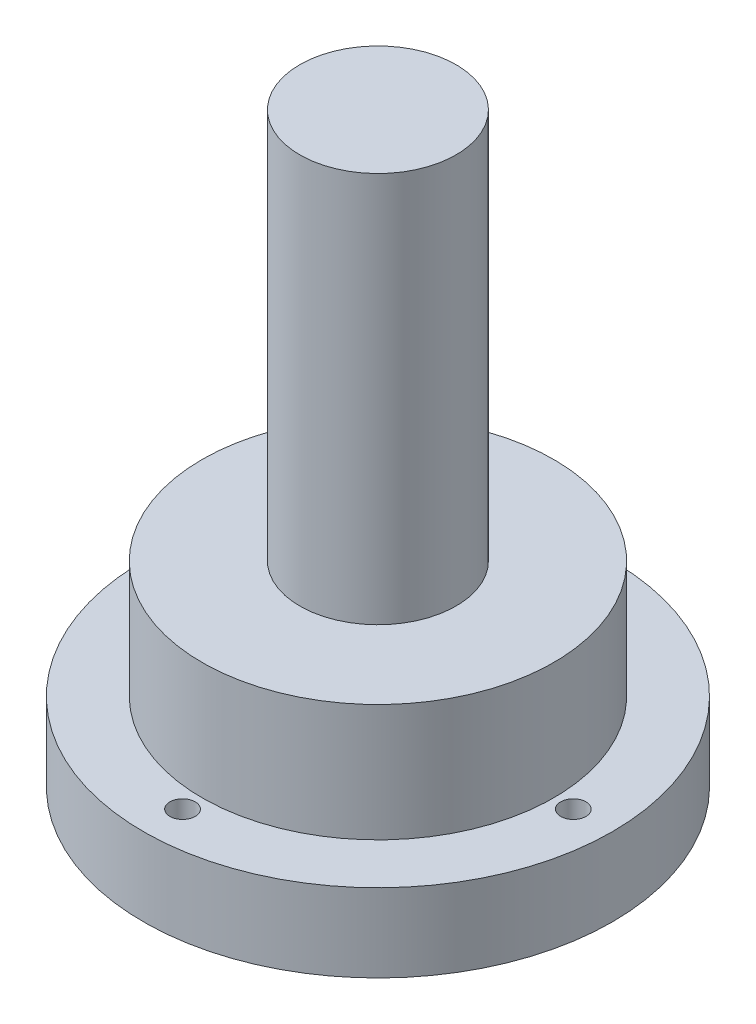
ISO-10303-21;
HEADER;
FILE_DESCRIPTION(('STEP AP214'),'2;1');
FILE_NAME('part.step','',(''),(''),'','','');
FILE_SCHEMA(('AUTOMOTIVE_DESIGN { 1 0 10303 214 1 1 1 1 }'));
ENDSEC;
DATA;
#1=APPLICATION_CONTEXT('core data for automotive mechanical design processes');
#2=APPLICATION_PROTOCOL_DEFINITION('international standard','automotive_design',2000,#1);
#3=PRODUCT_CONTEXT('',#1,'mechanical');
#4=PRODUCT('Part','Part','',(#3));
#5=PRODUCT_RELATED_PRODUCT_CATEGORY('part','',(#4));
#6=PRODUCT_DEFINITION_FORMATION('','',#4);
#7=PRODUCT_DEFINITION_CONTEXT('part definition',#1,'design');
#8=PRODUCT_DEFINITION('design','',#6,#7);
#9=PRODUCT_DEFINITION_SHAPE('','',#8);
#10=(LENGTH_UNIT() NAMED_UNIT(*) SI_UNIT(.MILLI.,.METRE.));
#11=(NAMED_UNIT(*) PLANE_ANGLE_UNIT() SI_UNIT($,.RADIAN.));
#12=(NAMED_UNIT(*) SI_UNIT($,.STERADIAN.) SOLID_ANGLE_UNIT());
#13=UNCERTAINTY_MEASURE_WITH_UNIT(LENGTH_MEASURE(1.E-05),#10,'distance_accuracy_value','');
#14=(GEOMETRIC_REPRESENTATION_CONTEXT(3) GLOBAL_UNCERTAINTY_ASSIGNED_CONTEXT((#13)) GLOBAL_UNIT_ASSIGNED_CONTEXT((#10,
#11,#12)) REPRESENTATION_CONTEXT('',''));
#15=CARTESIAN_POINT('',(0.,0.,0.));
#16=DIRECTION('',(0.,0.,1.));
#17=DIRECTION('',(1.,0.,0.));
#18=AXIS2_PLACEMENT_3D('',#15,#16,#17);
#19=CARTESIAN_POINT('',(0.,0.,0.));
#20=DIRECTION('',(0.,1.,0.));
#21=DIRECTION('',(1.,0.,0.));
#22=AXIS2_PLACEMENT_3D('',#19,#20,#21);
#23=PLANE('',#22);
#24=CARTESIAN_POINT('',(-25.,0.,0.));
#25=DIRECTION('',(0.,1.,0.));
#26=DIRECTION('',(1.,0.,0.));
#27=AXIS2_PLACEMENT_3D('',#24,#25,#26);
#28=CIRCLE('',#27,1.621);
#29=CARTESIAN_POINT('',(-26.621,0.,0.));
#30=VERTEX_POINT('',#29);
#31=EDGE_CURVE('E20',#30,#30,#28,.T.);
#32=ORIENTED_EDGE('',*,*,#31,.T.);
#33=EDGE_LOOP('',(#32));
#34=FACE_BOUND('',#33,.T.);
#35=CARTESIAN_POINT('',(25.,0.,0.));
#36=DIRECTION('',(0.,1.,0.));
#37=DIRECTION('',(1.,0.,0.));
#38=AXIS2_PLACEMENT_3D('',#35,#36,#37);
#39=CIRCLE('',#38,1.621);
#40=CARTESIAN_POINT('',(23.379,0.,0.));
#41=VERTEX_POINT('',#40);
#42=EDGE_CURVE('E119',#41,#41,#39,.T.);
#43=ORIENTED_EDGE('',*,*,#42,.T.);
#44=EDGE_LOOP('',(#43));
#45=FACE_BOUND('',#44,.T.);
#46=CARTESIAN_POINT('',(0.,0.,25.));
#47=DIRECTION('',(0.,1.,0.));
#48=DIRECTION('',(1.,0.,0.));
#49=AXIS2_PLACEMENT_3D('',#46,#47,#48);
#50=CIRCLE('',#49,1.621);
#51=CARTESIAN_POINT('',(-1.621,0.,25.));
#52=VERTEX_POINT('',#51);
#53=EDGE_CURVE('E143',#52,#52,#50,.T.);
#54=ORIENTED_EDGE('',*,*,#53,.T.);
#55=EDGE_LOOP('',(#54));
#56=FACE_BOUND('',#55,.T.);
#57=CARTESIAN_POINT('',(0.,0.,-25.));
#58=DIRECTION('',(0.,1.,0.));
#59=DIRECTION('',(1.,0.,0.));
#60=AXIS2_PLACEMENT_3D('',#57,#58,#59);
#61=CIRCLE('',#60,1.621);
#62=CARTESIAN_POINT('',(-1.621,0.,-25.));
#63=VERTEX_POINT('',#62);
#64=EDGE_CURVE('E163',#63,#63,#61,.T.);
#65=ORIENTED_EDGE('',*,*,#64,.T.);
#66=EDGE_LOOP('',(#65));
#67=FACE_BOUND('',#66,.T.);
#68=CARTESIAN_POINT('',(0.,0.,0.));
#69=DIRECTION('',(0.,1.,0.));
#70=DIRECTION('',(-1.,0.,0.));
#71=AXIS2_PLACEMENT_3D('',#68,#69,#70);
#72=CIRCLE('',#71,30.);
#73=CARTESIAN_POINT('',(30.,0.,0.));
#74=VERTEX_POINT('',#73);
#75=EDGE_CURVE('E11',#74,#74,#72,.T.);
#76=ORIENTED_EDGE('',*,*,#75,.F.);
#77=EDGE_LOOP('',(#76));
#78=FACE_BOUND('',#77,.T.);
#79=ADVANCED_FACE('F17',(#34,#45,#56,#67,#78),#23,.F.);
#80=CARTESIAN_POINT('',(0.,10.,0.));
#81=DIRECTION('',(0.,1.,0.));
#82=DIRECTION('',(1.,0.,0.));
#83=AXIS2_PLACEMENT_3D('',#80,#81,#82);
#84=PLANE('',#83);
#85=CARTESIAN_POINT('',(0.,10.,0.));
#86=DIRECTION('',(0.,-1.,0.));
#87=DIRECTION('',(1.,0.,0.));
#88=AXIS2_PLACEMENT_3D('',#85,#86,#87);
#89=CIRCLE('',#88,22.5);
#90=CARTESIAN_POINT('',(-22.5,10.,0.));
#91=VERTEX_POINT('',#90);
#92=EDGE_CURVE('E137',#91,#91,#89,.T.);
#93=ORIENTED_EDGE('',*,*,#92,.T.);
#94=EDGE_LOOP('',(#93));
#95=FACE_BOUND('',#94,.T.);
#96=CARTESIAN_POINT('',(-25.,10.,0.));
#97=DIRECTION('',(0.,-1.,0.));
#98=DIRECTION('',(1.,0.,0.));
#99=AXIS2_PLACEMENT_3D('',#96,#97,#98);
#100=CIRCLE('',#99,1.621);
#101=CARTESIAN_POINT('',(-26.621,10.,0.));
#102=VERTEX_POINT('',#101);
#103=EDGE_CURVE('E112',#102,#102,#100,.T.);
#104=ORIENTED_EDGE('',*,*,#103,.T.);
#105=EDGE_LOOP('',(#104));
#106=FACE_BOUND('',#105,.T.);
#107=CARTESIAN_POINT('',(25.,10.,0.));
#108=DIRECTION('',(0.,-1.,0.));
#109=DIRECTION('',(1.,0.,0.));
#110=AXIS2_PLACEMENT_3D('',#107,#108,#109);
#111=CIRCLE('',#110,1.621);
#112=CARTESIAN_POINT('',(23.379,10.,0.));
#113=VERTEX_POINT('',#112);
#114=EDGE_CURVE('E139',#113,#113,#111,.T.);
#115=ORIENTED_EDGE('',*,*,#114,.T.);
#116=EDGE_LOOP('',(#115));
#117=FACE_BOUND('',#116,.T.);
#118=CARTESIAN_POINT('',(0.,10.,25.));
#119=DIRECTION('',(0.,-1.,0.));
#120=DIRECTION('',(1.,0.,0.));
#121=AXIS2_PLACEMENT_3D('',#118,#119,#120);
#122=CIRCLE('',#121,1.621);
#123=CARTESIAN_POINT('',(-1.621,10.,25.));
#124=VERTEX_POINT('',#123);
#125=EDGE_CURVE('E159',#124,#124,#122,.T.);
#126=ORIENTED_EDGE('',*,*,#125,.T.);
#127=EDGE_LOOP('',(#126));
#128=FACE_BOUND('',#127,.T.);
#129=CARTESIAN_POINT('',(0.,10.,-25.));
#130=DIRECTION('',(0.,-1.,0.));
#131=DIRECTION('',(1.,0.,0.));
#132=AXIS2_PLACEMENT_3D('',#129,#130,#131);
#133=CIRCLE('',#132,1.621);
#134=CARTESIAN_POINT('',(-1.621,10.,-25.));
#135=VERTEX_POINT('',#134);
#136=EDGE_CURVE('E156',#135,#135,#133,.T.);
#137=ORIENTED_EDGE('',*,*,#136,.T.);
#138=EDGE_LOOP('',(#137));
#139=FACE_BOUND('',#138,.T.);
#140=CARTESIAN_POINT('',(0.,10.,0.));
#141=DIRECTION('',(0.,1.,0.));
#142=DIRECTION('',(-1.,0.,0.));
#143=AXIS2_PLACEMENT_3D('',#140,#141,#142);
#144=CIRCLE('',#143,30.);
#145=CARTESIAN_POINT('',(30.,10.,0.));
#146=VERTEX_POINT('',#145);
#147=EDGE_CURVE('E146',#146,#146,#144,.T.);
#148=ORIENTED_EDGE('',*,*,#147,.T.);
#149=EDGE_LOOP('',(#148));
#150=FACE_BOUND('',#149,.T.);
#151=ADVANCED_FACE('F116',(#95,#106,#117,#128,#139,#150),#84,.T.);
#152=CARTESIAN_POINT('',(0.,0.,0.));
#153=DIRECTION('',(0.,1.,0.));
#154=DIRECTION('',(-1.,0.,0.));
#155=AXIS2_PLACEMENT_3D('',#152,#153,#154);
#156=CYLINDRICAL_SURFACE('',#155,30.);
#157=ORIENTED_EDGE('',*,*,#147,.F.);
#158=DIRECTION('',(0.,-1.,0.));
#159=VECTOR('',#158,1.);
#160=CARTESIAN_POINT('',(30.,0.,0.));
#161=LINE('',#160,#159);
#162=EDGE_CURVE('E27',#146,#74,#161,.T.);
#163=ORIENTED_EDGE('',*,*,#162,.T.);
#164=ORIENTED_EDGE('',*,*,#75,.T.);
#165=ORIENTED_EDGE('',*,*,#162,.F.);
#166=EDGE_LOOP('',(#157,#163,#164,#165));
#167=FACE_BOUND('',#166,.T.);
#168=ADVANCED_FACE('F286',(#167),#156,.T.);
#169=CARTESIAN_POINT('',(0.,25.,0.));
#170=DIRECTION('',(0.,1.,0.));
#171=DIRECTION('',(1.,0.,0.));
#172=AXIS2_PLACEMENT_3D('',#169,#170,#171);
#173=PLANE('',#172);
#174=CARTESIAN_POINT('',(0.,25.,0.));
#175=DIRECTION('',(0.,-1.,0.));
#176=DIRECTION('',(1.,0.,0.));
#177=AXIS2_PLACEMENT_3D('',#174,#175,#176);
#178=CIRCLE('',#177,10.);
#179=CARTESIAN_POINT('',(-10.,25.,0.));
#180=VERTEX_POINT('',#179);
#181=EDGE_CURVE('E60',#180,#180,#178,.T.);
#182=ORIENTED_EDGE('',*,*,#181,.T.);
#183=EDGE_LOOP('',(#182));
#184=FACE_BOUND('',#183,.T.);
#185=CARTESIAN_POINT('',(0.,25.,0.));
#186=DIRECTION('',(0.,1.,0.));
#187=DIRECTION('',(1.,0.,0.));
#188=AXIS2_PLACEMENT_3D('',#185,#186,#187);
#189=CIRCLE('',#188,22.5);
#190=CARTESIAN_POINT('',(-22.5,25.,0.));
#191=VERTEX_POINT('',#190);
#192=EDGE_CURVE('E138',#191,#191,#189,.T.);
#193=ORIENTED_EDGE('',*,*,#192,.T.);
#194=EDGE_LOOP('',(#193));
#195=FACE_BOUND('',#194,.T.);
#196=ADVANCED_FACE('F252',(#184,#195),#173,.T.);
#197=CARTESIAN_POINT('',(0.,10.,0.));
#198=DIRECTION('',(0.,1.,0.));
#199=DIRECTION('',(1.,0.,0.));
#200=AXIS2_PLACEMENT_3D('',#197,#198,#199);
#201=CYLINDRICAL_SURFACE('',#200,22.5);
#202=ORIENTED_EDGE('',*,*,#192,.F.);
#203=DIRECTION('',(0.,-1.,0.));
#204=VECTOR('',#203,1.);
#205=CARTESIAN_POINT('',(-22.5,10.,0.));
#206=LINE('',#205,#204);
#207=EDGE_CURVE('E133',#191,#91,#206,.T.);
#208=ORIENTED_EDGE('',*,*,#207,.T.);
#209=ORIENTED_EDGE('',*,*,#92,.F.);
#210=ORIENTED_EDGE('',*,*,#207,.F.);
#211=EDGE_LOOP('',(#202,#208,#209,#210));
#212=FACE_BOUND('',#211,.T.);
#213=ADVANCED_FACE('F240',(#212),#201,.T.);
#214=CARTESIAN_POINT('',(-25.,-78.4590300647707,0.));
#215=DIRECTION('',(0.,1.,0.));
#216=DIRECTION('',(1.,0.,0.));
#217=AXIS2_PLACEMENT_3D('',#214,#215,#216);
#218=CYLINDRICAL_SURFACE('',#217,1.621);
#219=ORIENTED_EDGE('',*,*,#103,.F.);
#220=DIRECTION('',(0.,-1.,0.));
#221=VECTOR('',#220,1.);
#222=CARTESIAN_POINT('',(-26.621,-78.4590300647707,0.));
#223=LINE('',#222,#221);
#224=EDGE_CURVE('E109',#102,#30,#223,.T.);
#225=ORIENTED_EDGE('',*,*,#224,.T.);
#226=ORIENTED_EDGE('',*,*,#31,.F.);
#227=ORIENTED_EDGE('',*,*,#224,.F.);
#228=EDGE_LOOP('',(#219,#225,#226,#227));
#229=FACE_BOUND('',#228,.T.);
#230=ADVANCED_FACE('F111',(#229),#218,.F.);
#231=CARTESIAN_POINT('',(25.,-78.4590300647707,0.));
#232=DIRECTION('',(0.,1.,0.));
#233=DIRECTION('',(1.,0.,0.));
#234=AXIS2_PLACEMENT_3D('',#231,#232,#233);
#235=CYLINDRICAL_SURFACE('',#234,1.621);
#236=ORIENTED_EDGE('',*,*,#114,.F.);
#237=DIRECTION('',(0.,-1.,0.));
#238=VECTOR('',#237,1.);
#239=CARTESIAN_POINT('',(23.379,-78.4590300647707,0.));
#240=LINE('',#239,#238);
#241=EDGE_CURVE('E125',#113,#41,#240,.T.);
#242=ORIENTED_EDGE('',*,*,#241,.T.);
#243=ORIENTED_EDGE('',*,*,#42,.F.);
#244=ORIENTED_EDGE('',*,*,#241,.F.);
#245=EDGE_LOOP('',(#236,#242,#243,#244));
#246=FACE_BOUND('',#245,.T.);
#247=ADVANCED_FACE('F239',(#246),#235,.F.);
#248=CARTESIAN_POINT('',(0.,-78.4590300647707,25.));
#249=DIRECTION('',(0.,1.,0.));
#250=DIRECTION('',(1.,0.,0.));
#251=AXIS2_PLACEMENT_3D('',#248,#249,#250);
#252=CYLINDRICAL_SURFACE('',#251,1.621);
#253=ORIENTED_EDGE('',*,*,#125,.F.);
#254=DIRECTION('',(0.,-1.,0.));
#255=VECTOR('',#254,1.);
#256=CARTESIAN_POINT('',(-1.621,-78.4590300647707,25.));
#257=LINE('',#256,#255);
#258=EDGE_CURVE('E149',#124,#52,#257,.T.);
#259=ORIENTED_EDGE('',*,*,#258,.T.);
#260=ORIENTED_EDGE('',*,*,#53,.F.);
#261=ORIENTED_EDGE('',*,*,#258,.F.);
#262=EDGE_LOOP('',(#253,#259,#260,#261));
#263=FACE_BOUND('',#262,.T.);
#264=ADVANCED_FACE('F293',(#263),#252,.F.);
#265=CARTESIAN_POINT('',(0.,-78.4590300647707,-25.));
#266=DIRECTION('',(0.,1.,0.));
#267=DIRECTION('',(1.,0.,0.));
#268=AXIS2_PLACEMENT_3D('',#265,#266,#267);
#269=CYLINDRICAL_SURFACE('',#268,1.621);
#270=ORIENTED_EDGE('',*,*,#136,.F.);
#271=DIRECTION('',(0.,-1.,0.));
#272=VECTOR('',#271,1.);
#273=CARTESIAN_POINT('',(-1.621,-78.4590300647707,-25.));
#274=LINE('',#273,#272);
#275=EDGE_CURVE('E72',#135,#63,#274,.T.);
#276=ORIENTED_EDGE('',*,*,#275,.T.);
#277=ORIENTED_EDGE('',*,*,#64,.F.);
#278=ORIENTED_EDGE('',*,*,#275,.F.);
#279=EDGE_LOOP('',(#270,#276,#277,#278));
#280=FACE_BOUND('',#279,.T.);
#281=ADVANCED_FACE('F266',(#280),#269,.F.);
#282=CARTESIAN_POINT('',(0.,75.,0.));
#283=DIRECTION('',(0.,1.,0.));
#284=DIRECTION('',(1.,0.,0.));
#285=AXIS2_PLACEMENT_3D('',#282,#283,#284);
#286=PLANE('',#285);
#287=CARTESIAN_POINT('',(0.,75.,0.));
#288=DIRECTION('',(0.,1.,0.));
#289=DIRECTION('',(1.,0.,0.));
#290=AXIS2_PLACEMENT_3D('',#287,#288,#289);
#291=CIRCLE('',#290,10.);
#292=CARTESIAN_POINT('',(-10.,75.,0.));
#293=VERTEX_POINT('',#292);
#294=EDGE_CURVE('E130',#293,#293,#291,.T.);
#295=ORIENTED_EDGE('',*,*,#294,.T.);
#296=EDGE_LOOP('',(#295));
#297=FACE_BOUND('',#296,.T.);
#298=ADVANCED_FACE('F260',(#297),#286,.T.);
#299=CARTESIAN_POINT('',(0.,25.,0.));
#300=DIRECTION('',(0.,1.,0.));
#301=DIRECTION('',(1.,0.,0.));
#302=AXIS2_PLACEMENT_3D('',#299,#300,#301);
#303=CYLINDRICAL_SURFACE('',#302,10.);
#304=ORIENTED_EDGE('',*,*,#294,.F.);
#305=DIRECTION('',(0.,-1.,0.));
#306=VECTOR('',#305,1.);
#307=CARTESIAN_POINT('',(-10.,25.,0.));
#308=LINE('',#307,#306);
#309=EDGE_CURVE('E53',#293,#180,#308,.T.);
#310=ORIENTED_EDGE('',*,*,#309,.T.);
#311=ORIENTED_EDGE('',*,*,#181,.F.);
#312=ORIENTED_EDGE('',*,*,#309,.F.);
#313=EDGE_LOOP('',(#304,#310,#311,#312));
#314=FACE_BOUND('',#313,.T.);
#315=ADVANCED_FACE('F265',(#314),#303,.T.);
#316=CLOSED_SHELL('',(#79,#151,#168,#196,#213,#230,#247,#264,#281,#298,#315));
#317=MANIFOLD_SOLID_BREP('B1',#316);
#318=ADVANCED_BREP_SHAPE_REPRESENTATION('',(#18,#317),#14);
#319=SHAPE_DEFINITION_REPRESENTATION(#9,#318);
ENDSEC;
END-ISO-10303-21;
